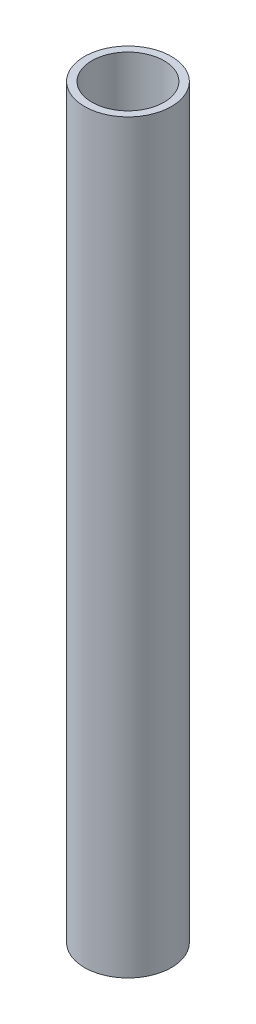
ISO-10303-21;
HEADER;
FILE_DESCRIPTION(('STEP AP214'),'2;1');
FILE_NAME('part.step','',(''),(''),'','','');
FILE_SCHEMA(('AUTOMOTIVE_DESIGN { 1 0 10303 214 1 1 1 1 }'));
ENDSEC;
DATA;
#1=APPLICATION_CONTEXT('core data for automotive mechanical design processes');
#2=APPLICATION_PROTOCOL_DEFINITION('international standard','automotive_design',2000,#1);
#3=PRODUCT_CONTEXT('',#1,'mechanical');
#4=PRODUCT('Part','Part','',(#3));
#5=PRODUCT_RELATED_PRODUCT_CATEGORY('part','',(#4));
#6=PRODUCT_DEFINITION_FORMATION('','',#4);
#7=PRODUCT_DEFINITION_CONTEXT('part definition',#1,'design');
#8=PRODUCT_DEFINITION('design','',#6,#7);
#9=PRODUCT_DEFINITION_SHAPE('','',#8);
#10=(LENGTH_UNIT() NAMED_UNIT(*) SI_UNIT(.MILLI.,.METRE.));
#11=(NAMED_UNIT(*) PLANE_ANGLE_UNIT() SI_UNIT($,.RADIAN.));
#12=(NAMED_UNIT(*) SI_UNIT($,.STERADIAN.) SOLID_ANGLE_UNIT());
#13=UNCERTAINTY_MEASURE_WITH_UNIT(LENGTH_MEASURE(1.E-05),#10,'distance_accuracy_value','');
#14=(GEOMETRIC_REPRESENTATION_CONTEXT(3) GLOBAL_UNCERTAINTY_ASSIGNED_CONTEXT((#13)) GLOBAL_UNIT_ASSIGNED_CONTEXT((#10,
#11,#12)) REPRESENTATION_CONTEXT('',''));
#15=CARTESIAN_POINT('',(0.,0.,0.));
#16=DIRECTION('',(0.,0.,1.));
#17=DIRECTION('',(1.,0.,0.));
#18=AXIS2_PLACEMENT_3D('',#15,#16,#17);
#19=CARTESIAN_POINT('',(0.,361.95,0.));
#20=DIRECTION('',(0.,1.,0.));
#21=DIRECTION('',(0.,0.,1.));
#22=AXIS2_PLACEMENT_3D('',#19,#20,#21);
#23=PLANE('',#22);
#24=CARTESIAN_POINT('',(0.,361.95,0.));
#25=DIRECTION('',(0.,1.,0.));
#26=DIRECTION('',(0.,0.,1.));
#27=AXIS2_PLACEMENT_3D('',#24,#25,#26);
#28=CIRCLE('',#27,21.082);
#29=CARTESIAN_POINT('',(0.,361.95,21.082));
#30=VERTEX_POINT('',#29);
#31=EDGE_CURVE('E10',#30,#30,#28,.T.);
#32=ORIENTED_EDGE('',*,*,#31,.T.);
#33=EDGE_LOOP('',(#32));
#34=FACE_BOUND('',#33,.T.);
#35=CARTESIAN_POINT('',(0.,361.95,0.));
#36=DIRECTION('',(0.,1.,0.));
#37=DIRECTION('',(0.,0.,1.));
#38=AXIS2_PLACEMENT_3D('',#35,#36,#37);
#39=CIRCLE('',#38,17.5006);
#40=CARTESIAN_POINT('',(0.,361.95,17.5006));
#41=VERTEX_POINT('',#40);
#42=EDGE_CURVE('E41',#41,#41,#39,.T.);
#43=ORIENTED_EDGE('',*,*,#42,.F.);
#44=EDGE_LOOP('',(#43));
#45=FACE_BOUND('',#44,.T.);
#46=ADVANCED_FACE('F30',(#34,#45),#23,.T.);
#47=CARTESIAN_POINT('',(0.,0.,0.));
#48=DIRECTION('',(0.,1.,0.));
#49=DIRECTION('',(0.,0.,1.));
#50=AXIS2_PLACEMENT_3D('',#47,#48,#49);
#51=PLANE('',#50);
#52=CARTESIAN_POINT('',(0.,0.,0.));
#53=DIRECTION('',(0.,1.,0.));
#54=DIRECTION('',(0.,0.,1.));
#55=AXIS2_PLACEMENT_3D('',#52,#53,#54);
#56=CIRCLE('',#55,21.082);
#57=CARTESIAN_POINT('',(0.,0.,21.082));
#58=VERTEX_POINT('',#57);
#59=EDGE_CURVE('E34',#58,#58,#56,.T.);
#60=ORIENTED_EDGE('',*,*,#59,.F.);
#61=EDGE_LOOP('',(#60));
#62=FACE_BOUND('',#61,.T.);
#63=CARTESIAN_POINT('',(0.,0.,0.));
#64=DIRECTION('',(0.,1.,0.));
#65=DIRECTION('',(0.,0.,1.));
#66=AXIS2_PLACEMENT_3D('',#63,#64,#65);
#67=CIRCLE('',#66,17.5006);
#68=CARTESIAN_POINT('',(0.,0.,17.5006));
#69=VERTEX_POINT('',#68);
#70=EDGE_CURVE('E43',#69,#69,#67,.T.);
#71=ORIENTED_EDGE('',*,*,#70,.T.);
#72=EDGE_LOOP('',(#71));
#73=FACE_BOUND('',#72,.T.);
#74=ADVANCED_FACE('F53',(#62,#73),#51,.F.);
#75=CARTESIAN_POINT('',(0.,361.95,0.));
#76=DIRECTION('',(0.,-1.,0.));
#77=DIRECTION('',(0.,0.,-1.));
#78=AXIS2_PLACEMENT_3D('',#75,#76,#77);
#79=CYLINDRICAL_SURFACE('',#78,21.082);
#80=ORIENTED_EDGE('',*,*,#31,.F.);
#81=EDGE_LOOP('',(#80));
#82=FACE_BOUND('',#81,.T.);
#83=ORIENTED_EDGE('',*,*,#59,.T.);
#84=EDGE_LOOP('',(#83));
#85=FACE_BOUND('',#84,.T.);
#86=ADVANCED_FACE('F32',(#82,#85),#79,.T.);
#87=CARTESIAN_POINT('',(0.,361.95,0.));
#88=DIRECTION('',(0.,-1.,0.));
#89=DIRECTION('',(0.,0.,-1.));
#90=AXIS2_PLACEMENT_3D('',#87,#88,#89);
#91=CYLINDRICAL_SURFACE('',#90,17.5006);
#92=ORIENTED_EDGE('',*,*,#42,.T.);
#93=EDGE_LOOP('',(#92));
#94=FACE_BOUND('',#93,.T.);
#95=ORIENTED_EDGE('',*,*,#70,.F.);
#96=EDGE_LOOP('',(#95));
#97=FACE_BOUND('',#96,.T.);
#98=ADVANCED_FACE('F49',(#94,#97),#91,.F.);
#99=CLOSED_SHELL('',(#46,#74,#86,#98));
#100=MANIFOLD_SOLID_BREP('B2',#99);
#101=ADVANCED_BREP_SHAPE_REPRESENTATION('',(#18,#100),#14);
#102=SHAPE_DEFINITION_REPRESENTATION(#9,#101);
ENDSEC;
END-ISO-10303-21;
